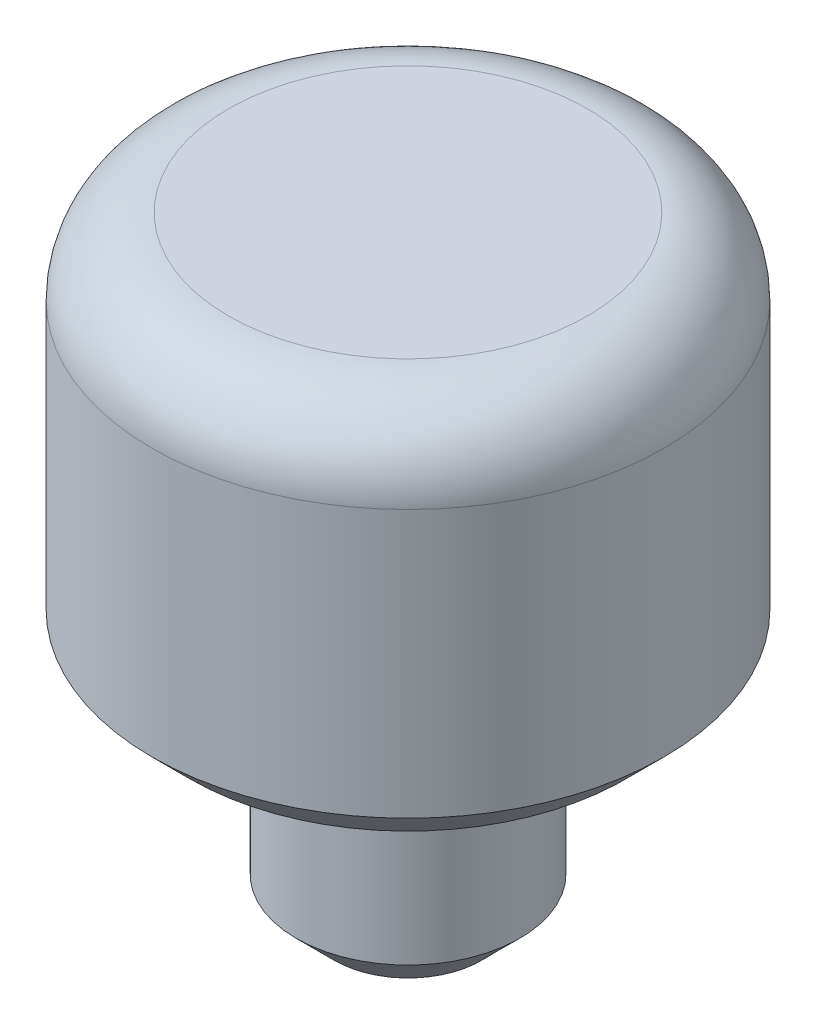
ISO-10303-21;
HEADER;
FILE_DESCRIPTION(('STEP AP214'),'2;1');
FILE_NAME('part.step','',(''),(''),'','','');
FILE_SCHEMA(('AUTOMOTIVE_DESIGN { 1 0 10303 214 1 1 1 1 }'));
ENDSEC;
DATA;
#1=APPLICATION_CONTEXT('core data for automotive mechanical design processes');
#2=APPLICATION_PROTOCOL_DEFINITION('international standard','automotive_design',2000,#1);
#3=PRODUCT_CONTEXT('',#1,'mechanical');
#4=PRODUCT('Part','Part','',(#3));
#5=PRODUCT_RELATED_PRODUCT_CATEGORY('part','',(#4));
#6=PRODUCT_DEFINITION_FORMATION('','',#4);
#7=PRODUCT_DEFINITION_CONTEXT('part definition',#1,'design');
#8=PRODUCT_DEFINITION('design','',#6,#7);
#9=PRODUCT_DEFINITION_SHAPE('','',#8);
#10=(LENGTH_UNIT() NAMED_UNIT(*) SI_UNIT(.MILLI.,.METRE.));
#11=(NAMED_UNIT(*) PLANE_ANGLE_UNIT() SI_UNIT($,.RADIAN.));
#12=(NAMED_UNIT(*) SI_UNIT($,.STERADIAN.) SOLID_ANGLE_UNIT());
#13=UNCERTAINTY_MEASURE_WITH_UNIT(LENGTH_MEASURE(1.E-05),#10,'distance_accuracy_value','');
#14=(GEOMETRIC_REPRESENTATION_CONTEXT(3) GLOBAL_UNCERTAINTY_ASSIGNED_CONTEXT((#13)) GLOBAL_UNIT_ASSIGNED_CONTEXT((#10,
#11,#12)) REPRESENTATION_CONTEXT('',''));
#15=CARTESIAN_POINT('',(0.,0.,0.));
#16=DIRECTION('',(0.,0.,1.));
#17=DIRECTION('',(1.,0.,0.));
#18=AXIS2_PLACEMENT_3D('',#15,#16,#17);
#19=CARTESIAN_POINT('',(0.,10.,0.));
#20=DIRECTION('',(0.,-1.,0.));
#21=DIRECTION('',(0.,0.,-1.));
#22=AXIS2_PLACEMENT_3D('',#19,#20,#21);
#23=CYLINDRICAL_SURFACE('',#22,6.7);
#24=CARTESIAN_POINT('',(0.,8.,0.));
#25=DIRECTION('',(0.,1.,0.));
#26=DIRECTION('',(0.,0.,1.));
#27=AXIS2_PLACEMENT_3D('',#24,#25,#26);
#28=CIRCLE('',#27,6.7);
#29=CARTESIAN_POINT('',(0.,8.,6.7));
#30=VERTEX_POINT('',#29);
#31=EDGE_CURVE('E10',#30,#30,#28,.F.);
#32=ORIENTED_EDGE('',*,*,#31,.T.);
#33=EDGE_LOOP('',(#32));
#34=FACE_BOUND('',#33,.T.);
#35=CARTESIAN_POINT('',(0.,0.999999999999997,0.));
#36=DIRECTION('',(0.,1.,0.));
#37=DIRECTION('',(0.,0.,1.));
#38=AXIS2_PLACEMENT_3D('',#35,#36,#37);
#39=CIRCLE('',#38,6.7);
#40=CARTESIAN_POINT('',(0.,0.999999999999997,6.7));
#41=VERTEX_POINT('',#40);
#42=EDGE_CURVE('E60',#41,#41,#39,.T.);
#43=ORIENTED_EDGE('',*,*,#42,.T.);
#44=EDGE_LOOP('',(#43));
#45=FACE_BOUND('',#44,.T.);
#46=ADVANCED_FACE('F31',(#34,#45),#23,.T.);
#47=CARTESIAN_POINT('',(0.,10.,0.));
#48=DIRECTION('',(0.,1.,0.));
#49=DIRECTION('',(0.,0.,1.));
#50=AXIS2_PLACEMENT_3D('',#47,#48,#49);
#51=PLANE('',#50);
#52=CARTESIAN_POINT('',(0.,10.,0.));
#53=DIRECTION('',(0.,1.,0.));
#54=DIRECTION('',(0.,0.,1.));
#55=AXIS2_PLACEMENT_3D('',#52,#53,#54);
#56=CIRCLE('',#55,4.7);
#57=CARTESIAN_POINT('',(0.,10.,4.7));
#58=VERTEX_POINT('',#57);
#59=EDGE_CURVE('E38',#58,#58,#56,.T.);
#60=ORIENTED_EDGE('',*,*,#59,.T.);
#61=EDGE_LOOP('',(#60));
#62=FACE_BOUND('',#61,.T.);
#63=ADVANCED_FACE('F84',(#62),#51,.T.);
#64=CARTESIAN_POINT('',(0.,0.,0.));
#65=DIRECTION('',(0.,1.,0.));
#66=DIRECTION('',(0.,0.,1.));
#67=AXIS2_PLACEMENT_3D('',#64,#65,#66);
#68=PLANE('',#67);
#69=CARTESIAN_POINT('',(0.,0.,0.));
#70=DIRECTION('',(0.,1.,0.));
#71=DIRECTION('',(0.,0.,1.));
#72=AXIS2_PLACEMENT_3D('',#69,#70,#71);
#73=CIRCLE('',#72,3.325);
#74=CARTESIAN_POINT('',(0.,0.,3.325));
#75=VERTEX_POINT('',#74);
#76=EDGE_CURVE('E46',#75,#75,#73,.T.);
#77=ORIENTED_EDGE('',*,*,#76,.T.);
#78=EDGE_LOOP('',(#77));
#79=FACE_BOUND('',#78,.T.);
#80=CARTESIAN_POINT('',(0.,0.,0.));
#81=DIRECTION('',(0.,1.,0.));
#82=DIRECTION('',(0.,0.,1.));
#83=AXIS2_PLACEMENT_3D('',#80,#81,#82);
#84=CIRCLE('',#83,5.7);
#85=CARTESIAN_POINT('',(0.,0.,5.7));
#86=VERTEX_POINT('',#85);
#87=EDGE_CURVE('E57',#86,#86,#84,.F.);
#88=ORIENTED_EDGE('',*,*,#87,.T.);
#89=EDGE_LOOP('',(#88));
#90=FACE_BOUND('',#89,.T.);
#91=ADVANCED_FACE('F88',(#79,#90),#68,.F.);
#92=CARTESIAN_POINT('',(0.,-6.,0.));
#93=DIRECTION('',(0.,1.,0.));
#94=DIRECTION('',(0.,0.,1.));
#95=AXIS2_PLACEMENT_3D('',#92,#93,#94);
#96=CYLINDRICAL_SURFACE('',#95,2.925);
#97=CARTESIAN_POINT('',(0.,-0.4,0.));
#98=DIRECTION('',(0.,1.,0.));
#99=DIRECTION('',(0.,0.,1.));
#100=AXIS2_PLACEMENT_3D('',#97,#98,#99);
#101=CIRCLE('',#100,2.925);
#102=CARTESIAN_POINT('',(0.,-0.4,2.925));
#103=VERTEX_POINT('',#102);
#104=EDGE_CURVE('E42',#103,#103,#101,.F.);
#105=ORIENTED_EDGE('',*,*,#104,.T.);
#106=EDGE_LOOP('',(#105));
#107=FACE_BOUND('',#106,.T.);
#108=CARTESIAN_POINT('',(0.,-5.00000000000001,0.));
#109=DIRECTION('',(0.,1.,0.));
#110=DIRECTION('',(0.,0.,1.));
#111=AXIS2_PLACEMENT_3D('',#108,#109,#110);
#112=CIRCLE('',#111,2.925);
#113=CARTESIAN_POINT('',(0.,-5.00000000000001,2.925));
#114=VERTEX_POINT('',#113);
#115=EDGE_CURVE('E54',#114,#114,#112,.T.);
#116=ORIENTED_EDGE('',*,*,#115,.T.);
#117=EDGE_LOOP('',(#116));
#118=FACE_BOUND('',#117,.T.);
#119=ADVANCED_FACE('F78',(#107,#118),#96,.T.);
#120=CARTESIAN_POINT('',(0.,-6.,0.));
#121=DIRECTION('',(0.,1.,0.));
#122=DIRECTION('',(0.,0.,1.));
#123=AXIS2_PLACEMENT_3D('',#120,#121,#122);
#124=PLANE('',#123);
#125=CARTESIAN_POINT('',(0.,-6.,0.));
#126=DIRECTION('',(0.,1.,0.));
#127=DIRECTION('',(0.,0.,1.));
#128=AXIS2_PLACEMENT_3D('',#125,#126,#127);
#129=CIRCLE('',#128,1.925);
#130=CARTESIAN_POINT('',(0.,-6.,1.925));
#131=VERTEX_POINT('',#130);
#132=EDGE_CURVE('E51',#131,#131,#129,.F.);
#133=ORIENTED_EDGE('',*,*,#132,.T.);
#134=EDGE_LOOP('',(#133));
#135=FACE_BOUND('',#134,.T.);
#136=ADVANCED_FACE('F68',(#135),#124,.F.);
#137=CARTESIAN_POINT('',(0.,0.999999999999997,0.));
#138=DIRECTION('',(0.,1.,0.));
#139=DIRECTION('',(0.,0.,1.));
#140=AXIS2_PLACEMENT_3D('',#137,#138,#139);
#141=CONICAL_SURFACE('',#140,6.7,0.785398163397451);
#142=ORIENTED_EDGE('',*,*,#87,.F.);
#143=EDGE_LOOP('',(#142));
#144=FACE_BOUND('',#143,.T.);
#145=ORIENTED_EDGE('',*,*,#42,.F.);
#146=EDGE_LOOP('',(#145));
#147=FACE_BOUND('',#146,.T.);
#148=ADVANCED_FACE('F65',(#144,#147),#141,.T.);
#149=CARTESIAN_POINT('',(0.,-5.00000000000001,0.));
#150=DIRECTION('',(0.,1.,0.));
#151=DIRECTION('',(0.,0.,1.));
#152=AXIS2_PLACEMENT_3D('',#149,#150,#151);
#153=CONICAL_SURFACE('',#152,2.925,0.78539816339745);
#154=ORIENTED_EDGE('',*,*,#132,.F.);
#155=EDGE_LOOP('',(#154));
#156=FACE_BOUND('',#155,.T.);
#157=ORIENTED_EDGE('',*,*,#115,.F.);
#158=EDGE_LOOP('',(#157));
#159=FACE_BOUND('',#158,.T.);
#160=ADVANCED_FACE('F67',(#156,#159),#153,.T.);
#161=CARTESIAN_POINT('',(0.,-0.4,0.));
#162=DIRECTION('',(0.,1.,0.));
#163=DIRECTION('',(0.,0.,1.));
#164=AXIS2_PLACEMENT_3D('',#161,#162,#163);
#165=TOROIDAL_SURFACE('',#164,3.325,0.4);
#166=ORIENTED_EDGE('',*,*,#104,.F.);
#167=EDGE_LOOP('',(#166));
#168=FACE_BOUND('',#167,.T.);
#169=ORIENTED_EDGE('',*,*,#76,.F.);
#170=EDGE_LOOP('',(#169));
#171=FACE_BOUND('',#170,.T.);
#172=ADVANCED_FACE('F75',(#168,#171),#165,.F.);
#173=CARTESIAN_POINT('',(0.,8.,0.));
#174=DIRECTION('',(0.,1.,0.));
#175=DIRECTION('',(0.,0.,1.));
#176=AXIS2_PLACEMENT_3D('',#173,#174,#175);
#177=TOROIDAL_SURFACE('',#176,4.7,2.);
#178=ORIENTED_EDGE('',*,*,#31,.F.);
#179=EDGE_LOOP('',(#178));
#180=FACE_BOUND('',#179,.T.);
#181=ORIENTED_EDGE('',*,*,#59,.F.);
#182=EDGE_LOOP('',(#181));
#183=FACE_BOUND('',#182,.T.);
#184=ADVANCED_FACE('F33',(#180,#183),#177,.T.);
#185=CLOSED_SHELL('',(#46,#63,#91,#119,#136,#148,#160,#172,#184));
#186=MANIFOLD_SOLID_BREP('B2',#185);
#187=ADVANCED_BREP_SHAPE_REPRESENTATION('',(#18,#186),#14);
#188=SHAPE_DEFINITION_REPRESENTATION(#9,#187);
ENDSEC;
END-ISO-10303-21;
